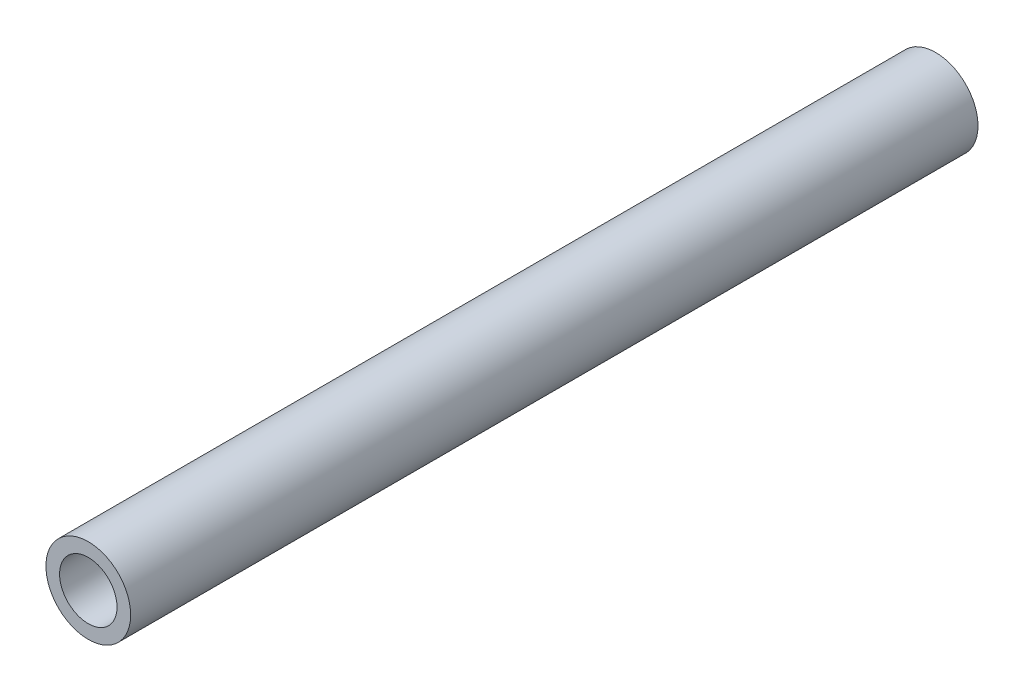
ISO-10303-21;
HEADER;
FILE_DESCRIPTION(('STEP AP214'),'2;1');
FILE_NAME('part.step','',(''),(''),'','','');
FILE_SCHEMA(('AUTOMOTIVE_DESIGN { 1 0 10303 214 1 1 1 1 }'));
ENDSEC;
DATA;
#1=APPLICATION_CONTEXT('core data for automotive mechanical design processes');
#2=APPLICATION_PROTOCOL_DEFINITION('international standard','automotive_design',2000,#1);
#3=PRODUCT_CONTEXT('',#1,'mechanical');
#4=PRODUCT('Part','Part','',(#3));
#5=PRODUCT_RELATED_PRODUCT_CATEGORY('part','',(#4));
#6=PRODUCT_DEFINITION_FORMATION('','',#4);
#7=PRODUCT_DEFINITION_CONTEXT('part definition',#1,'design');
#8=PRODUCT_DEFINITION('design','',#6,#7);
#9=PRODUCT_DEFINITION_SHAPE('','',#8);
#10=(LENGTH_UNIT() NAMED_UNIT(*) SI_UNIT(.MILLI.,.METRE.));
#11=(NAMED_UNIT(*) PLANE_ANGLE_UNIT() SI_UNIT($,.RADIAN.));
#12=(NAMED_UNIT(*) SI_UNIT($,.STERADIAN.) SOLID_ANGLE_UNIT());
#13=UNCERTAINTY_MEASURE_WITH_UNIT(LENGTH_MEASURE(1.E-05),#10,'distance_accuracy_value','');
#14=(GEOMETRIC_REPRESENTATION_CONTEXT(3) GLOBAL_UNCERTAINTY_ASSIGNED_CONTEXT((#13)) GLOBAL_UNIT_ASSIGNED_CONTEXT((#10,
#11,#12)) REPRESENTATION_CONTEXT('',''));
#15=CARTESIAN_POINT('',(0.,0.,0.));
#16=DIRECTION('',(0.,0.,1.));
#17=DIRECTION('',(1.,0.,0.));
#18=AXIS2_PLACEMENT_3D('',#15,#16,#17);
#19=CARTESIAN_POINT('',(0.,0.,31.75));
#20=DIRECTION('',(0.,0.,1.));
#21=DIRECTION('',(1.,0.,0.));
#22=AXIS2_PLACEMENT_3D('',#19,#20,#21);
#23=PLANE('',#22);
#24=CARTESIAN_POINT('',(0.,0.,31.75));
#25=DIRECTION('',(0.,0.,1.));
#26=DIRECTION('',(1.,0.,0.));
#27=AXIS2_PLACEMENT_3D('',#24,#25,#26);
#28=CIRCLE('',#27,3.175);
#29=CARTESIAN_POINT('',(3.175,0.,31.75));
#30=VERTEX_POINT('',#29);
#31=EDGE_CURVE('E10',#30,#30,#28,.T.);
#32=ORIENTED_EDGE('',*,*,#31,.T.);
#33=EDGE_LOOP('',(#32));
#34=FACE_BOUND('',#33,.T.);
#35=CARTESIAN_POINT('',(0.,0.,31.75));
#36=DIRECTION('',(0.,0.,1.));
#37=DIRECTION('',(1.,0.,0.));
#38=AXIS2_PLACEMENT_3D('',#35,#36,#37);
#39=CIRCLE('',#38,2.15265);
#40=CARTESIAN_POINT('',(2.15265,0.,31.75));
#41=VERTEX_POINT('',#40);
#42=EDGE_CURVE('E42',#41,#41,#39,.T.);
#43=ORIENTED_EDGE('',*,*,#42,.F.);
#44=EDGE_LOOP('',(#43));
#45=FACE_BOUND('',#44,.T.);
#46=ADVANCED_FACE('F31',(#34,#45),#23,.T.);
#47=CARTESIAN_POINT('',(0.,0.,-31.75));
#48=DIRECTION('',(0.,0.,1.));
#49=DIRECTION('',(1.,0.,0.));
#50=AXIS2_PLACEMENT_3D('',#47,#48,#49);
#51=PLANE('',#50);
#52=CARTESIAN_POINT('',(0.,0.,-31.75));
#53=DIRECTION('',(0.,0.,1.));
#54=DIRECTION('',(1.,0.,0.));
#55=AXIS2_PLACEMENT_3D('',#52,#53,#54);
#56=CIRCLE('',#55,3.175);
#57=CARTESIAN_POINT('',(3.175,0.,-31.75));
#58=VERTEX_POINT('',#57);
#59=EDGE_CURVE('E35',#58,#58,#56,.T.);
#60=ORIENTED_EDGE('',*,*,#59,.F.);
#61=EDGE_LOOP('',(#60));
#62=FACE_BOUND('',#61,.T.);
#63=CARTESIAN_POINT('',(0.,0.,-31.75));
#64=DIRECTION('',(0.,0.,1.));
#65=DIRECTION('',(1.,0.,0.));
#66=AXIS2_PLACEMENT_3D('',#63,#64,#65);
#67=CIRCLE('',#66,2.15265);
#68=CARTESIAN_POINT('',(2.15265,0.,-31.75));
#69=VERTEX_POINT('',#68);
#70=EDGE_CURVE('E44',#69,#69,#67,.T.);
#71=ORIENTED_EDGE('',*,*,#70,.T.);
#72=EDGE_LOOP('',(#71));
#73=FACE_BOUND('',#72,.T.);
#74=ADVANCED_FACE('F54',(#62,#73),#51,.F.);
#75=CARTESIAN_POINT('',(0.,0.,31.75));
#76=DIRECTION('',(0.,0.,-1.));
#77=DIRECTION('',(-1.,0.,0.));
#78=AXIS2_PLACEMENT_3D('',#75,#76,#77);
#79=CYLINDRICAL_SURFACE('',#78,3.175);
#80=ORIENTED_EDGE('',*,*,#31,.F.);
#81=EDGE_LOOP('',(#80));
#82=FACE_BOUND('',#81,.T.);
#83=ORIENTED_EDGE('',*,*,#59,.T.);
#84=EDGE_LOOP('',(#83));
#85=FACE_BOUND('',#84,.T.);
#86=ADVANCED_FACE('F33',(#82,#85),#79,.T.);
#87=CARTESIAN_POINT('',(0.,0.,31.75));
#88=DIRECTION('',(0.,0.,-1.));
#89=DIRECTION('',(-1.,0.,0.));
#90=AXIS2_PLACEMENT_3D('',#87,#88,#89);
#91=CYLINDRICAL_SURFACE('',#90,2.15265);
#92=ORIENTED_EDGE('',*,*,#42,.T.);
#93=EDGE_LOOP('',(#92));
#94=FACE_BOUND('',#93,.T.);
#95=ORIENTED_EDGE('',*,*,#70,.F.);
#96=EDGE_LOOP('',(#95));
#97=FACE_BOUND('',#96,.T.);
#98=ADVANCED_FACE('F50',(#94,#97),#91,.F.);
#99=CLOSED_SHELL('',(#46,#74,#86,#98));
#100=MANIFOLD_SOLID_BREP('B2',#99);
#101=ADVANCED_BREP_SHAPE_REPRESENTATION('',(#18,#100),#14);
#102=SHAPE_DEFINITION_REPRESENTATION(#9,#101);
ENDSEC;
END-ISO-10303-21;
